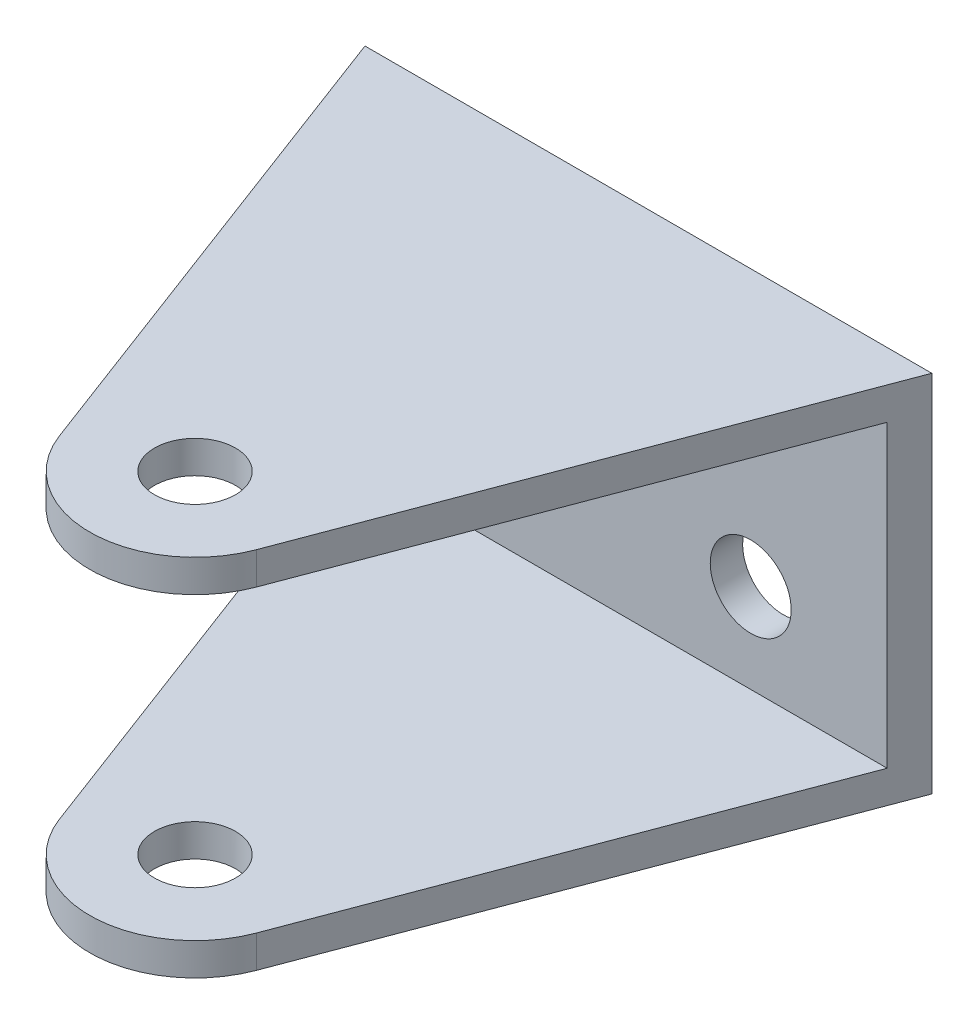
ISO-10303-21;
HEADER;
FILE_DESCRIPTION(('STEP AP214'),'2;1');
FILE_NAME('part.step','',(''),(''),'','','');
FILE_SCHEMA(('AUTOMOTIVE_DESIGN { 1 0 10303 214 1 1 1 1 }'));
ENDSEC;
DATA;
#1=APPLICATION_CONTEXT('core data for automotive mechanical design processes');
#2=APPLICATION_PROTOCOL_DEFINITION('international standard','automotive_design',2000,#1);
#3=PRODUCT_CONTEXT('',#1,'mechanical');
#4=PRODUCT('Part','Part','',(#3));
#5=PRODUCT_RELATED_PRODUCT_CATEGORY('part','',(#4));
#6=PRODUCT_DEFINITION_FORMATION('','',#4);
#7=PRODUCT_DEFINITION_CONTEXT('part definition',#1,'design');
#8=PRODUCT_DEFINITION('design','',#6,#7);
#9=PRODUCT_DEFINITION_SHAPE('','',#8);
#10=(LENGTH_UNIT() NAMED_UNIT(*) SI_UNIT(.MILLI.,.METRE.));
#11=(NAMED_UNIT(*) PLANE_ANGLE_UNIT() SI_UNIT($,.RADIAN.));
#12=(NAMED_UNIT(*) SI_UNIT($,.STERADIAN.) SOLID_ANGLE_UNIT());
#13=UNCERTAINTY_MEASURE_WITH_UNIT(LENGTH_MEASURE(1.E-05),#10,'distance_accuracy_value','');
#14=(GEOMETRIC_REPRESENTATION_CONTEXT(3) GLOBAL_UNCERTAINTY_ASSIGNED_CONTEXT((#13)) GLOBAL_UNIT_ASSIGNED_CONTEXT((#10,
#11,#12)) REPRESENTATION_CONTEXT('',''));
#15=CARTESIAN_POINT('',(0.,0.,0.));
#16=DIRECTION('',(0.,0.,1.));
#17=DIRECTION('',(1.,0.,0.));
#18=AXIS2_PLACEMENT_3D('',#15,#16,#17);
#19=CARTESIAN_POINT('',(0.858254713281791,74.29987629617,88.89));
#20=DIRECTION('',(0.,1.,0.));
#21=DIRECTION('',(0.,0.,1.));
#22=AXIS2_PLACEMENT_3D('',#19,#20,#21);
#23=CYLINDRICAL_SURFACE('',#22,13.);
#24=CARTESIAN_POINT('',(0.858254713281791,103.29987629617,88.89));
#25=DIRECTION('',(0.,-1.,0.));
#26=DIRECTION('',(0.,0.,-1.));
#27=AXIS2_PLACEMENT_3D('',#24,#25,#26);
#28=CIRCLE('',#27,13.);
#29=CARTESIAN_POINT('',(-11.3060993990815,103.29987629617,93.475683049343));
#30=VERTEX_POINT('',#29);
#31=CARTESIAN_POINT('',(13.022608825645,103.29987629617,93.475683049343));
#32=VERTEX_POINT('',#31);
#33=EDGE_CURVE('E155',#30,#32,#28,.F.);
#34=ORIENTED_EDGE('',*,*,#33,.F.);
#35=DIRECTION('',(0.,1.,0.));
#36=VECTOR('',#35,1.);
#37=CARTESIAN_POINT('',(-11.3060993990815,74.29987629617,93.475683049343));
#38=LINE('',#37,#36);
#39=CARTESIAN_POINT('',(-11.3060993990815,99.29987629617,93.475683049343));
#40=VERTEX_POINT('',#39);
#41=EDGE_CURVE('E178',#40,#30,#38,.T.);
#42=ORIENTED_EDGE('',*,*,#41,.F.);
#43=CARTESIAN_POINT('',(0.858254713281791,99.29987629617,88.89));
#44=DIRECTION('',(0.,1.,0.));
#45=DIRECTION('',(-1.,0.,0.));
#46=AXIS2_PLACEMENT_3D('',#43,#44,#45);
#47=CIRCLE('',#46,13.);
#48=CARTESIAN_POINT('',(13.022608825645,99.29987629617,93.475683049343));
#49=VERTEX_POINT('',#48);
#50=EDGE_CURVE('E182',#40,#49,#47,.T.);
#51=ORIENTED_EDGE('',*,*,#50,.T.);
#52=DIRECTION('',(0.,1.,0.));
#53=VECTOR('',#52,1.);
#54=CARTESIAN_POINT('',(13.022608825645,74.29987629617,93.475683049343));
#55=LINE('',#54,#53);
#56=EDGE_CURVE('E177',#49,#32,#55,.T.);
#57=ORIENTED_EDGE('',*,*,#56,.T.);
#58=EDGE_LOOP('',(#34,#42,#51,#57));
#59=FACE_BOUND('',#58,.T.);
#60=ADVANCED_FACE('F57',(#59),#23,.T.);
#61=CARTESIAN_POINT('',(0.858254713281791,74.29987629617,88.89));
#62=DIRECTION('',(0.,1.,0.));
#63=DIRECTION('',(0.,0.,1.));
#64=AXIS2_PLACEMENT_3D('',#61,#62,#63);
#65=CYLINDRICAL_SURFACE('',#64,5.);
#66=CARTESIAN_POINT('',(0.858254713281791,103.29987629617,88.89));
#67=DIRECTION('',(0.,-1.,0.));
#68=DIRECTION('',(0.,0.,-1.));
#69=AXIS2_PLACEMENT_3D('',#66,#67,#68);
#70=CIRCLE('',#69,5.);
#71=CARTESIAN_POINT('',(0.858254713281791,103.29987629617,83.89));
#72=VERTEX_POINT('',#71);
#73=EDGE_CURVE('E136',#72,#72,#70,.F.);
#74=ORIENTED_EDGE('',*,*,#73,.T.);
#75=EDGE_LOOP('',(#74));
#76=FACE_BOUND('',#75,.T.);
#77=CARTESIAN_POINT('',(0.858254713281791,99.29987629617,88.89));
#78=DIRECTION('',(0.,1.,0.));
#79=DIRECTION('',(-1.,0.,0.));
#80=AXIS2_PLACEMENT_3D('',#77,#78,#79);
#81=CIRCLE('',#80,5.);
#82=CARTESIAN_POINT('',(-4.14174528671821,99.29987629617,88.89));
#83=VERTEX_POINT('',#82);
#84=EDGE_CURVE('E188',#83,#83,#81,.T.);
#85=ORIENTED_EDGE('',*,*,#84,.F.);
#86=EDGE_LOOP('',(#85));
#87=FACE_BOUND('',#86,.T.);
#88=ADVANCED_FACE('F256',(#76,#87),#65,.F.);
#89=CARTESIAN_POINT('',(-17.5,114.3,102.9));
#90=DIRECTION('',(0.,0.,-1.));
#91=DIRECTION('',(-1.,0.,0.));
#92=AXIS2_PLACEMENT_3D('',#89,#90,#91);
#93=CYLINDRICAL_SURFACE('',#92,5.00000000000001);
#94=CARTESIAN_POINT('',(-17.5,114.3,36.9));
#95=DIRECTION('',(0.,0.,-1.));
#96=DIRECTION('',(-1.,0.,0.));
#97=AXIS2_PLACEMENT_3D('',#94,#95,#96);
#98=CIRCLE('',#97,5.00000000000001);
#99=CARTESIAN_POINT('',(-22.5,114.3,36.9));
#100=VERTEX_POINT('',#99);
#101=EDGE_CURVE('E152',#100,#100,#98,.T.);
#102=ORIENTED_EDGE('',*,*,#101,.F.);
#103=EDGE_LOOP('',(#102));
#104=FACE_BOUND('',#103,.T.);
#105=CARTESIAN_POINT('',(-17.5,114.3,32.9));
#106=DIRECTION('',(0.,0.,1.));
#107=DIRECTION('',(1.,0.,0.));
#108=AXIS2_PLACEMENT_3D('',#105,#106,#107);
#109=CIRCLE('',#108,5.00000000000001);
#110=CARTESIAN_POINT('',(-12.5,114.3,32.9));
#111=VERTEX_POINT('',#110);
#112=EDGE_CURVE('E193',#111,#111,#109,.T.);
#113=ORIENTED_EDGE('',*,*,#112,.F.);
#114=EDGE_LOOP('',(#113));
#115=FACE_BOUND('',#114,.T.);
#116=ADVANCED_FACE('F262',(#104,#115),#93,.F.);
#117=CARTESIAN_POINT('',(17.5,114.3,102.9));
#118=DIRECTION('',(0.,0.,-1.));
#119=DIRECTION('',(-1.,0.,0.));
#120=AXIS2_PLACEMENT_3D('',#117,#118,#119);
#121=CYLINDRICAL_SURFACE('',#120,5.00000000000001);
#122=CARTESIAN_POINT('',(17.5,114.3,36.9));
#123=DIRECTION('',(0.,0.,-1.));
#124=DIRECTION('',(-1.,0.,0.));
#125=AXIS2_PLACEMENT_3D('',#122,#123,#124);
#126=CIRCLE('',#125,5.00000000000001);
#127=CARTESIAN_POINT('',(12.5,114.3,36.9));
#128=VERTEX_POINT('',#127);
#129=EDGE_CURVE('E147',#128,#128,#126,.T.);
#130=ORIENTED_EDGE('',*,*,#129,.F.);
#131=EDGE_LOOP('',(#130));
#132=FACE_BOUND('',#131,.T.);
#133=CARTESIAN_POINT('',(17.5,114.3,32.9));
#134=DIRECTION('',(0.,0.,1.));
#135=DIRECTION('',(1.,0.,0.));
#136=AXIS2_PLACEMENT_3D('',#133,#134,#135);
#137=CIRCLE('',#136,5.00000000000001);
#138=CARTESIAN_POINT('',(22.5,114.3,32.9));
#139=VERTEX_POINT('',#138);
#140=EDGE_CURVE('E189',#139,#139,#137,.T.);
#141=ORIENTED_EDGE('',*,*,#140,.F.);
#142=EDGE_LOOP('',(#141));
#143=FACE_BOUND('',#142,.T.);
#144=ADVANCED_FACE('F252',(#132,#143),#121,.F.);
#145=CARTESIAN_POINT('',(0.,0.,32.9));
#146=DIRECTION('',(0.,0.,1.));
#147=DIRECTION('',(1.,0.,0.));
#148=AXIS2_PLACEMENT_3D('',#145,#146,#147);
#149=PLANE('',#148);
#150=DIRECTION('',(-1.,0.,0.));
#151=VECTOR('',#150,1.);
#152=CARTESIAN_POINT('',(-34.1417452867183,144.29987629617,32.9));
#153=LINE('',#152,#151);
#154=CARTESIAN_POINT('',(35.8582547132817,144.29987629617,32.9));
#155=VERTEX_POINT('',#154);
#156=CARTESIAN_POINT('',(-34.1417452867183,144.29987629617,32.9));
#157=VERTEX_POINT('',#156);
#158=EDGE_CURVE('E196',#155,#157,#153,.T.);
#159=ORIENTED_EDGE('',*,*,#158,.F.);
#160=DIRECTION('',(0.,1.,0.));
#161=VECTOR('',#160,1.);
#162=CARTESIAN_POINT('',(35.8582547132817,99.29987629617,32.9));
#163=LINE('',#162,#161);
#164=CARTESIAN_POINT('',(35.8582547132817,99.29987629617,32.9));
#165=VERTEX_POINT('',#164);
#166=EDGE_CURVE('E66',#165,#155,#163,.T.);
#167=ORIENTED_EDGE('',*,*,#166,.F.);
#168=DIRECTION('',(1.,0.,0.));
#169=VECTOR('',#168,1.);
#170=CARTESIAN_POINT('',(-34.1417452867183,99.29987629617,32.9));
#171=LINE('',#170,#169);
#172=CARTESIAN_POINT('',(-34.1417452867183,99.29987629617,32.9));
#173=VERTEX_POINT('',#172);
#174=EDGE_CURVE('E202',#173,#165,#171,.T.);
#175=ORIENTED_EDGE('',*,*,#174,.F.);
#176=DIRECTION('',(0.,-1.,0.));
#177=VECTOR('',#176,1.);
#178=CARTESIAN_POINT('',(-34.1417452867183,99.29987629617,32.9));
#179=LINE('',#178,#177);
#180=EDGE_CURVE('E199',#157,#173,#179,.T.);
#181=ORIENTED_EDGE('',*,*,#180,.F.);
#182=EDGE_LOOP('',(#159,#167,#175,#181));
#183=FACE_BOUND('',#182,.T.);
#184=ORIENTED_EDGE('',*,*,#112,.T.);
#185=EDGE_LOOP('',(#184));
#186=FACE_BOUND('',#185,.T.);
#187=ORIENTED_EDGE('',*,*,#140,.T.);
#188=EDGE_LOOP('',(#187));
#189=FACE_BOUND('',#188,.T.);
#190=ADVANCED_FACE('F240',(#183,#186,#189),#149,.F.);
#191=CARTESIAN_POINT('',(-34.1417452867183,144.29987629617,102.9));
#192=DIRECTION('',(0.,-1.,0.));
#193=DIRECTION('',(0.,0.,-1.));
#194=AXIS2_PLACEMENT_3D('',#191,#192,#193);
#195=PLANE('',#194);
#196=CARTESIAN_POINT('',(0.858254713281791,144.29987629617,88.89));
#197=DIRECTION('',(0.,1.,0.));
#198=DIRECTION('',(0.,0.,1.));
#199=AXIS2_PLACEMENT_3D('',#196,#197,#198);
#200=CIRCLE('',#199,5.);
#201=CARTESIAN_POINT('',(0.858254713281791,144.29987629617,93.89));
#202=VERTEX_POINT('',#201);
#203=EDGE_CURVE('E161',#202,#202,#200,.T.);
#204=ORIENTED_EDGE('',*,*,#203,.F.);
#205=EDGE_LOOP('',(#204));
#206=FACE_BOUND('',#205,.T.);
#207=CARTESIAN_POINT('',(0.858254713281791,144.29987629617,88.89));
#208=DIRECTION('',(0.,1.,0.));
#209=DIRECTION('',(0.,0.,1.));
#210=AXIS2_PLACEMENT_3D('',#207,#208,#209);
#211=CIRCLE('',#210,13.);
#212=CARTESIAN_POINT('',(-11.3060993990815,144.29987629617,93.475683049343));
#213=VERTEX_POINT('',#212);
#214=CARTESIAN_POINT('',(13.022608825645,144.29987629617,93.475683049343));
#215=VERTEX_POINT('',#214);
#216=EDGE_CURVE('E164',#213,#215,#211,.T.);
#217=ORIENTED_EDGE('',*,*,#216,.T.);
#218=DIRECTION('',(-0.35274484994946,0.,0.935719547104865));
#219=VECTOR('',#218,1.);
#220=CARTESIAN_POINT('',(42.2557617432907,144.29987629617,15.9294549117363));
#221=LINE('',#220,#219);
#222=EDGE_CURVE('E170',#155,#215,#221,.T.);
#223=ORIENTED_EDGE('',*,*,#222,.F.);
#224=ORIENTED_EDGE('',*,*,#158,.T.);
#225=DIRECTION('',(0.35274484994946,0.,0.935719547104865));
#226=VECTOR('',#225,1.);
#227=CARTESIAN_POINT('',(-40.7528357465776,144.29987629617,15.3628862140575));
#228=LINE('',#227,#226);
#229=EDGE_CURVE('E167',#157,#213,#228,.T.);
#230=ORIENTED_EDGE('',*,*,#229,.T.);
#231=EDGE_LOOP('',(#217,#223,#224,#230));
#232=FACE_BOUND('',#231,.T.);
#233=ADVANCED_FACE('F59',(#206,#232),#195,.F.);
#234=CARTESIAN_POINT('',(-34.1417452867183,99.29987629617,102.9));
#235=DIRECTION('',(0.,1.,0.));
#236=DIRECTION('',(-1.,0.,0.));
#237=AXIS2_PLACEMENT_3D('',#234,#235,#236);
#238=PLANE('',#237);
#239=ORIENTED_EDGE('',*,*,#84,.T.);
#240=EDGE_LOOP('',(#239));
#241=FACE_BOUND('',#240,.T.);
#242=ORIENTED_EDGE('',*,*,#174,.T.);
#243=DIRECTION('',(-0.35274484994946,0.,0.935719547104865));
#244=VECTOR('',#243,1.);
#245=CARTESIAN_POINT('',(4.04331208499137,99.29987629617,117.294892545069));
#246=LINE('',#245,#244);
#247=EDGE_CURVE('E81',#165,#49,#246,.T.);
#248=ORIENTED_EDGE('',*,*,#247,.T.);
#249=ORIENTED_EDGE('',*,*,#50,.F.);
#250=DIRECTION('',(0.35274484994946,0.,0.935719547104865));
#251=VECTOR('',#250,1.);
#252=CARTESIAN_POINT('',(-11.0368277000385,99.29987629617,94.1899749583893));
#253=LINE('',#252,#251);
#254=EDGE_CURVE('E185',#173,#40,#253,.T.);
#255=ORIENTED_EDGE('',*,*,#254,.F.);
#256=EDGE_LOOP('',(#242,#248,#249,#255));
#257=FACE_BOUND('',#256,.T.);
#258=ADVANCED_FACE('F245',(#241,#257),#238,.F.);
#259=CARTESIAN_POINT('',(-40.7528357465776,74.29987629617,15.3628862140575));
#260=DIRECTION('',(-0.935719547104865,0.,0.35274484994946));
#261=DIRECTION('',(0.35274484994946,0.,0.935719547104865));
#262=AXIS2_PLACEMENT_3D('',#259,#260,#261);
#263=PLANE('',#262);
#264=DIRECTION('',(0.35274484994946,0.,0.935719547104865));
#265=VECTOR('',#264,1.);
#266=CARTESIAN_POINT('',(-40.7528357465776,103.29987629617,15.3628862140575));
#267=LINE('',#266,#265);
#268=CARTESIAN_POINT('',(-32.633836849662,103.29987629617,36.9));
#269=VERTEX_POINT('',#268);
#270=EDGE_CURVE('E145',#269,#30,#267,.T.);
#271=ORIENTED_EDGE('',*,*,#270,.F.);
#272=DIRECTION('',(0.,-1.,0.));
#273=VECTOR('',#272,1.);
#274=CARTESIAN_POINT('',(-32.633836849662,74.29987629617,36.9));
#275=LINE('',#274,#273);
#276=CARTESIAN_POINT('',(-32.633836849662,140.29987629617,36.9));
#277=VERTEX_POINT('',#276);
#278=EDGE_CURVE('E139',#277,#269,#275,.T.);
#279=ORIENTED_EDGE('',*,*,#278,.F.);
#280=DIRECTION('',(-0.35274484994946,0.,-0.935719547104865));
#281=VECTOR('',#280,1.);
#282=CARTESIAN_POINT('',(-40.7528357465776,140.29987629617,15.3628862140575));
#283=LINE('',#282,#281);
#284=CARTESIAN_POINT('',(-11.3060993990815,140.29987629617,93.475683049343));
#285=VERTEX_POINT('',#284);
#286=EDGE_CURVE('E124',#285,#277,#283,.T.);
#287=ORIENTED_EDGE('',*,*,#286,.F.);
#288=EDGE_CURVE('E174',#285,#213,#38,.T.);
#289=ORIENTED_EDGE('',*,*,#288,.T.);
#290=ORIENTED_EDGE('',*,*,#229,.F.);
#291=ORIENTED_EDGE('',*,*,#180,.T.);
#292=ORIENTED_EDGE('',*,*,#254,.T.);
#293=ORIENTED_EDGE('',*,*,#41,.T.);
#294=EDGE_LOOP('',(#271,#279,#287,#289,#290,#291,#292,#293));
#295=FACE_BOUND('',#294,.T.);
#296=ADVANCED_FACE('F143',(#295),#263,.T.);
#297=CARTESIAN_POINT('',(0.858254713281791,140.29987629617,88.89));
#298=DIRECTION('',(0.,1.,0.));
#299=DIRECTION('',(0.,0.,1.));
#300=AXIS2_PLACEMENT_3D('',#297,#298,#299);
#301=CIRCLE('',#300,13.);
#302=CARTESIAN_POINT('',(13.022608825645,140.29987629617,93.475683049343));
#303=VERTEX_POINT('',#302);
#304=EDGE_CURVE('E131',#303,#285,#301,.F.);
#305=ORIENTED_EDGE('',*,*,#304,.F.);
#306=EDGE_CURVE('E175',#303,#215,#55,.T.);
#307=ORIENTED_EDGE('',*,*,#306,.T.);
#308=ORIENTED_EDGE('',*,*,#216,.F.);
#309=ORIENTED_EDGE('',*,*,#288,.F.);
#310=EDGE_LOOP('',(#305,#307,#308,#309));
#311=FACE_BOUND('',#310,.T.);
#312=ADVANCED_FACE('F232',(#311),#23,.T.);
#313=CARTESIAN_POINT('',(42.2557617432907,74.29987629617,15.9294549117363));
#314=DIRECTION('',(-0.935719547104865,0.,-0.35274484994946));
#315=DIRECTION('',(-0.35274484994946,0.,0.935719547104865));
#316=AXIS2_PLACEMENT_3D('',#313,#314,#315);
#317=PLANE('',#316);
#318=DIRECTION('',(0.,-1.,0.));
#319=VECTOR('',#318,1.);
#320=CARTESIAN_POINT('',(34.3503462762256,74.29987629617,36.9));
#321=LINE('',#320,#319);
#322=CARTESIAN_POINT('',(34.3503462762256,140.29987629617,36.9));
#323=VERTEX_POINT('',#322);
#324=CARTESIAN_POINT('',(34.3503462762256,103.29987629617,36.9));
#325=VERTEX_POINT('',#324);
#326=EDGE_CURVE('E12',#323,#325,#321,.T.);
#327=ORIENTED_EDGE('',*,*,#326,.T.);
#328=DIRECTION('',(-0.35274484994946,0.,0.935719547104865));
#329=VECTOR('',#328,1.);
#330=CARTESIAN_POINT('',(42.2557617432907,103.29987629617,15.9294549117363));
#331=LINE('',#330,#329);
#332=EDGE_CURVE('E212',#325,#32,#331,.T.);
#333=ORIENTED_EDGE('',*,*,#332,.T.);
#334=ORIENTED_EDGE('',*,*,#56,.F.);
#335=ORIENTED_EDGE('',*,*,#247,.F.);
#336=ORIENTED_EDGE('',*,*,#166,.T.);
#337=ORIENTED_EDGE('',*,*,#222,.T.);
#338=ORIENTED_EDGE('',*,*,#306,.F.);
#339=DIRECTION('',(0.35274484994946,0.,-0.935719547104865));
#340=VECTOR('',#339,1.);
#341=CARTESIAN_POINT('',(42.2557617432907,140.29987629617,15.9294549117363));
#342=LINE('',#341,#340);
#343=EDGE_CURVE('E209',#303,#323,#342,.T.);
#344=ORIENTED_EDGE('',*,*,#343,.T.);
#345=EDGE_LOOP('',(#327,#333,#334,#335,#336,#337,#338,#344));
#346=FACE_BOUND('',#345,.T.);
#347=ADVANCED_FACE('F230',(#346),#317,.F.);
#348=CARTESIAN_POINT('',(0.858254713281791,140.29987629617,88.89));
#349=DIRECTION('',(0.,1.,0.));
#350=DIRECTION('',(0.,0.,1.));
#351=AXIS2_PLACEMENT_3D('',#348,#349,#350);
#352=CIRCLE('',#351,5.);
#353=CARTESIAN_POINT('',(0.858254713281791,140.29987629617,93.89));
#354=VERTEX_POINT('',#353);
#355=EDGE_CURVE('E140',#354,#354,#352,.F.);
#356=ORIENTED_EDGE('',*,*,#355,.T.);
#357=EDGE_LOOP('',(#356));
#358=FACE_BOUND('',#357,.T.);
#359=ORIENTED_EDGE('',*,*,#203,.T.);
#360=EDGE_LOOP('',(#359));
#361=FACE_BOUND('',#360,.T.);
#362=ADVANCED_FACE('F264',(#358,#361),#65,.F.);
#363=CARTESIAN_POINT('',(-34.1417452867183,0.,36.9));
#364=DIRECTION('',(0.,0.,-1.));
#365=DIRECTION('',(-1.,0.,0.));
#366=AXIS2_PLACEMENT_3D('',#363,#364,#365);
#367=PLANE('',#366);
#368=ORIENTED_EDGE('',*,*,#101,.T.);
#369=EDGE_LOOP('',(#368));
#370=FACE_BOUND('',#369,.T.);
#371=ORIENTED_EDGE('',*,*,#129,.T.);
#372=EDGE_LOOP('',(#371));
#373=FACE_BOUND('',#372,.T.);
#374=ORIENTED_EDGE('',*,*,#278,.T.);
#375=DIRECTION('',(1.,0.,0.));
#376=VECTOR('',#375,1.);
#377=CARTESIAN_POINT('',(-34.1417452867183,103.29987629617,36.9));
#378=LINE('',#377,#376);
#379=EDGE_CURVE('E73',#269,#325,#378,.T.);
#380=ORIENTED_EDGE('',*,*,#379,.T.);
#381=ORIENTED_EDGE('',*,*,#326,.F.);
#382=DIRECTION('',(1.,0.,0.));
#383=VECTOR('',#382,1.);
#384=CARTESIAN_POINT('',(-34.1417452867183,140.29987629617,36.9));
#385=LINE('',#384,#383);
#386=EDGE_CURVE('E128',#277,#323,#385,.T.);
#387=ORIENTED_EDGE('',*,*,#386,.F.);
#388=EDGE_LOOP('',(#374,#380,#381,#387));
#389=FACE_BOUND('',#388,.T.);
#390=ADVANCED_FACE('F138',(#370,#373,#389),#367,.F.);
#391=CARTESIAN_POINT('',(-34.1417452867183,103.29987629617,0.));
#392=DIRECTION('',(0.,-1.,0.));
#393=DIRECTION('',(0.,0.,-1.));
#394=AXIS2_PLACEMENT_3D('',#391,#392,#393);
#395=PLANE('',#394);
#396=ORIENTED_EDGE('',*,*,#270,.T.);
#397=ORIENTED_EDGE('',*,*,#33,.T.);
#398=ORIENTED_EDGE('',*,*,#332,.F.);
#399=ORIENTED_EDGE('',*,*,#379,.F.);
#400=EDGE_LOOP('',(#396,#397,#398,#399));
#401=FACE_BOUND('',#400,.T.);
#402=ORIENTED_EDGE('',*,*,#73,.F.);
#403=EDGE_LOOP('',(#402));
#404=FACE_BOUND('',#403,.T.);
#405=ADVANCED_FACE('F279',(#401,#404),#395,.F.);
#406=CARTESIAN_POINT('',(-34.1417452867183,140.29987629617,0.));
#407=DIRECTION('',(0.,1.,0.));
#408=DIRECTION('',(0.,0.,1.));
#409=AXIS2_PLACEMENT_3D('',#406,#407,#408);
#410=PLANE('',#409);
#411=ORIENTED_EDGE('',*,*,#286,.T.);
#412=ORIENTED_EDGE('',*,*,#386,.T.);
#413=ORIENTED_EDGE('',*,*,#343,.F.);
#414=ORIENTED_EDGE('',*,*,#304,.T.);
#415=EDGE_LOOP('',(#411,#412,#413,#414));
#416=FACE_BOUND('',#415,.T.);
#417=ORIENTED_EDGE('',*,*,#355,.F.);
#418=EDGE_LOOP('',(#417));
#419=FACE_BOUND('',#418,.T.);
#420=ADVANCED_FACE('F126',(#416,#419),#410,.F.);
#421=CLOSED_SHELL('',(#60,#88,#116,#144,#190,#233,#258,#296,#312,#347,#362,#390,#405,#420));
#422=MANIFOLD_SOLID_BREP('B2',#421);
#423=ADVANCED_BREP_SHAPE_REPRESENTATION('',(#18,#422),#14);
#424=SHAPE_DEFINITION_REPRESENTATION(#9,#423);
ENDSEC;
END-ISO-10303-21;
